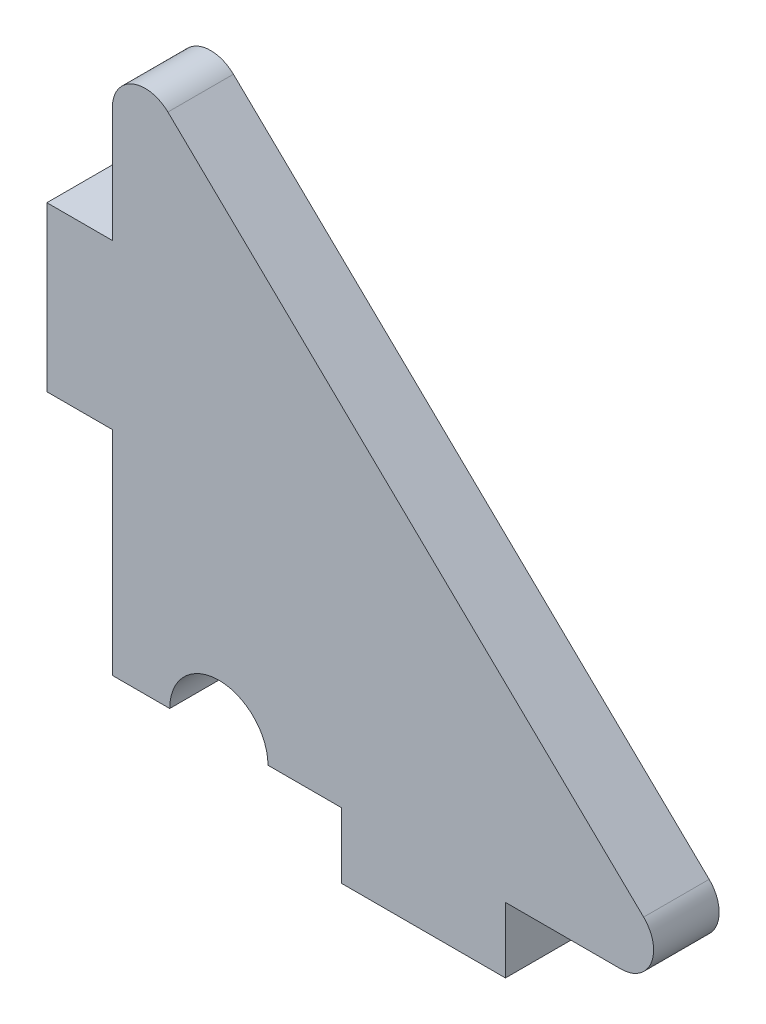
ISO-10303-21;
HEADER;
FILE_DESCRIPTION(('STEP AP214'),'2;1');
FILE_NAME('part.step','',(''),(''),'','','');
FILE_SCHEMA(('AUTOMOTIVE_DESIGN { 1 0 10303 214 1 1 1 1 }'));
ENDSEC;
DATA;
#1=APPLICATION_CONTEXT('core data for automotive mechanical design processes');
#2=APPLICATION_PROTOCOL_DEFINITION('international standard','automotive_design',2000,#1);
#3=PRODUCT_CONTEXT('',#1,'mechanical');
#4=PRODUCT('Part','Part','',(#3));
#5=PRODUCT_RELATED_PRODUCT_CATEGORY('part','',(#4));
#6=PRODUCT_DEFINITION_FORMATION('','',#4);
#7=PRODUCT_DEFINITION_CONTEXT('part definition',#1,'design');
#8=PRODUCT_DEFINITION('design','',#6,#7);
#9=PRODUCT_DEFINITION_SHAPE('','',#8);
#10=(LENGTH_UNIT() NAMED_UNIT(*) SI_UNIT(.MILLI.,.METRE.));
#11=(NAMED_UNIT(*) PLANE_ANGLE_UNIT() SI_UNIT($,.RADIAN.));
#12=(NAMED_UNIT(*) SI_UNIT($,.STERADIAN.) SOLID_ANGLE_UNIT());
#13=UNCERTAINTY_MEASURE_WITH_UNIT(LENGTH_MEASURE(1.E-05),#10,'distance_accuracy_value','');
#14=(GEOMETRIC_REPRESENTATION_CONTEXT(3) GLOBAL_UNCERTAINTY_ASSIGNED_CONTEXT((#13)) GLOBAL_UNIT_ASSIGNED_CONTEXT((#10,
#11,#12)) REPRESENTATION_CONTEXT('',''));
#15=CARTESIAN_POINT('',(0.,0.,0.));
#16=DIRECTION('',(0.,0.,1.));
#17=DIRECTION('',(1.,0.,0.));
#18=AXIS2_PLACEMENT_3D('',#15,#16,#17);
#19=CARTESIAN_POINT('',(0.,0.,4.));
#20=DIRECTION('',(1.,0.,0.));
#21=DIRECTION('',(0.,0.,-1.));
#22=AXIS2_PLACEMENT_3D('',#19,#20,#21);
#23=PLANE('',#22);
#24=DIRECTION('',(0.,-1.,0.));
#25=VECTOR('',#24,1.);
#26=CARTESIAN_POINT('',(0.,0.,0.));
#27=LINE('',#26,#25);
#28=CARTESIAN_POINT('',(0.,13.,0.));
#29=VERTEX_POINT('',#28);
#30=CARTESIAN_POINT('',(0.,0.,0.));
#31=VERTEX_POINT('',#30);
#32=EDGE_CURVE('E171',#29,#31,#27,.T.);
#33=ORIENTED_EDGE('',*,*,#32,.T.);
#34=DIRECTION('',(0.,0.,-1.));
#35=VECTOR('',#34,1.);
#36=CARTESIAN_POINT('',(0.,0.,4.));
#37=LINE('',#36,#35);
#38=CARTESIAN_POINT('',(0.,0.,4.));
#39=VERTEX_POINT('',#38);
#40=EDGE_CURVE('E11',#39,#31,#37,.T.);
#41=ORIENTED_EDGE('',*,*,#40,.F.);
#42=DIRECTION('',(0.,-1.,0.));
#43=VECTOR('',#42,1.);
#44=CARTESIAN_POINT('',(0.,0.,4.));
#45=LINE('',#44,#43);
#46=CARTESIAN_POINT('',(0.,13.,4.));
#47=VERTEX_POINT('',#46);
#48=EDGE_CURVE('E199',#47,#39,#45,.T.);
#49=ORIENTED_EDGE('',*,*,#48,.F.);
#50=DIRECTION('',(0.,0.,-1.));
#51=VECTOR('',#50,1.);
#52=CARTESIAN_POINT('',(0.,13.,4.));
#53=LINE('',#52,#51);
#54=EDGE_CURVE('E167',#47,#29,#53,.T.);
#55=ORIENTED_EDGE('',*,*,#54,.T.);
#56=EDGE_LOOP('',(#33,#41,#49,#55));
#57=FACE_BOUND('',#56,.T.);
#58=ADVANCED_FACE('F33',(#57),#23,.F.);
#59=CARTESIAN_POINT('',(0.,0.,4.));
#60=DIRECTION('',(0.,1.,0.));
#61=DIRECTION('',(0.,0.,1.));
#62=AXIS2_PLACEMENT_3D('',#59,#60,#61);
#63=PLANE('',#62);
#64=DIRECTION('',(1.,0.,0.));
#65=VECTOR('',#64,1.);
#66=CARTESIAN_POINT('',(0.,0.,0.));
#67=LINE('',#66,#65);
#68=CARTESIAN_POINT('',(3.5,0.,0.));
#69=VERTEX_POINT('',#68);
#70=EDGE_CURVE('E174',#31,#69,#67,.T.);
#71=ORIENTED_EDGE('',*,*,#70,.T.);
#72=DIRECTION('',(0.,0.,-1.));
#73=VECTOR('',#72,1.);
#74=CARTESIAN_POINT('',(3.5,0.,4.));
#75=LINE('',#74,#73);
#76=CARTESIAN_POINT('',(3.5,0.,4.));
#77=VERTEX_POINT('',#76);
#78=EDGE_CURVE('E41',#77,#69,#75,.T.);
#79=ORIENTED_EDGE('',*,*,#78,.F.);
#80=DIRECTION('',(1.,0.,0.));
#81=VECTOR('',#80,1.);
#82=CARTESIAN_POINT('',(0.,0.,4.));
#83=LINE('',#82,#81);
#84=EDGE_CURVE('E113',#39,#77,#83,.T.);
#85=ORIENTED_EDGE('',*,*,#84,.F.);
#86=ORIENTED_EDGE('',*,*,#40,.T.);
#87=EDGE_LOOP('',(#71,#79,#85,#86));
#88=FACE_BOUND('',#87,.T.);
#89=ADVANCED_FACE('F292',(#88),#63,.F.);
#90=CARTESIAN_POINT('',(6.5,0.,4.));
#91=DIRECTION('',(0.,0.,-1.));
#92=DIRECTION('',(-1.,0.,0.));
#93=AXIS2_PLACEMENT_3D('',#90,#91,#92);
#94=CYLINDRICAL_SURFACE('',#93,3.);
#95=CARTESIAN_POINT('',(6.5,0.,0.));
#96=DIRECTION('',(0.,0.,-1.));
#97=DIRECTION('',(1.,0.,0.));
#98=AXIS2_PLACEMENT_3D('',#95,#96,#97);
#99=CIRCLE('',#98,3.);
#100=CARTESIAN_POINT('',(9.5,0.,0.));
#101=VERTEX_POINT('',#100);
#102=EDGE_CURVE('E176',#69,#101,#99,.T.);
#103=ORIENTED_EDGE('',*,*,#102,.T.);
#104=DIRECTION('',(0.,0.,-1.));
#105=VECTOR('',#104,1.);
#106=CARTESIAN_POINT('',(9.5,0.,4.));
#107=LINE('',#106,#105);
#108=CARTESIAN_POINT('',(9.5,0.,4.));
#109=VERTEX_POINT('',#108);
#110=EDGE_CURVE('E227',#109,#101,#107,.T.);
#111=ORIENTED_EDGE('',*,*,#110,.F.);
#112=CARTESIAN_POINT('',(6.5,0.,4.));
#113=DIRECTION('',(0.,0.,-1.));
#114=DIRECTION('',(1.,0.,0.));
#115=AXIS2_PLACEMENT_3D('',#112,#113,#114);
#116=CIRCLE('',#115,3.);
#117=EDGE_CURVE('E235',#77,#109,#116,.T.);
#118=ORIENTED_EDGE('',*,*,#117,.F.);
#119=ORIENTED_EDGE('',*,*,#78,.T.);
#120=EDGE_LOOP('',(#103,#111,#118,#119));
#121=FACE_BOUND('',#120,.T.);
#122=ADVANCED_FACE('F233',(#121),#94,.F.);
#123=CARTESIAN_POINT('',(14.,0.,4.));
#124=DIRECTION('',(0.,1.,0.));
#125=DIRECTION('',(0.,0.,1.));
#126=AXIS2_PLACEMENT_3D('',#123,#124,#125);
#127=PLANE('',#126);
#128=DIRECTION('',(1.,0.,0.));
#129=VECTOR('',#128,1.);
#130=CARTESIAN_POINT('',(14.,0.,0.));
#131=LINE('',#130,#129);
#132=CARTESIAN_POINT('',(14.,0.,0.));
#133=VERTEX_POINT('',#132);
#134=EDGE_CURVE('E178',#101,#133,#131,.T.);
#135=ORIENTED_EDGE('',*,*,#134,.T.);
#136=DIRECTION('',(0.,0.,-1.));
#137=VECTOR('',#136,1.);
#138=CARTESIAN_POINT('',(14.,0.,4.));
#139=LINE('',#138,#137);
#140=CARTESIAN_POINT('',(14.,0.,4.));
#141=VERTEX_POINT('',#140);
#142=EDGE_CURVE('E224',#141,#133,#139,.T.);
#143=ORIENTED_EDGE('',*,*,#142,.F.);
#144=DIRECTION('',(1.,0.,0.));
#145=VECTOR('',#144,1.);
#146=CARTESIAN_POINT('',(14.,0.,4.));
#147=LINE('',#146,#145);
#148=EDGE_CURVE('E253',#109,#141,#147,.T.);
#149=ORIENTED_EDGE('',*,*,#148,.F.);
#150=ORIENTED_EDGE('',*,*,#110,.T.);
#151=EDGE_LOOP('',(#135,#143,#149,#150));
#152=FACE_BOUND('',#151,.T.);
#153=ADVANCED_FACE('F244',(#152),#127,.F.);
#154=CARTESIAN_POINT('',(14.,0.,4.));
#155=DIRECTION('',(1.,0.,0.));
#156=DIRECTION('',(0.,0.,-1.));
#157=AXIS2_PLACEMENT_3D('',#154,#155,#156);
#158=PLANE('',#157);
#159=DIRECTION('',(0.,-1.,0.));
#160=VECTOR('',#159,1.);
#161=CARTESIAN_POINT('',(14.,0.,0.));
#162=LINE('',#161,#160);
#163=CARTESIAN_POINT('',(14.,-4.,0.));
#164=VERTEX_POINT('',#163);
#165=EDGE_CURVE('E180',#133,#164,#162,.T.);
#166=ORIENTED_EDGE('',*,*,#165,.T.);
#167=DIRECTION('',(0.,0.,-1.));
#168=VECTOR('',#167,1.);
#169=CARTESIAN_POINT('',(14.,-4.,4.));
#170=LINE('',#169,#168);
#171=CARTESIAN_POINT('',(14.,-4.,4.));
#172=VERTEX_POINT('',#171);
#173=EDGE_CURVE('E221',#172,#164,#170,.T.);
#174=ORIENTED_EDGE('',*,*,#173,.F.);
#175=DIRECTION('',(0.,-1.,0.));
#176=VECTOR('',#175,1.);
#177=CARTESIAN_POINT('',(14.,0.,4.));
#178=LINE('',#177,#176);
#179=EDGE_CURVE('E250',#141,#172,#178,.T.);
#180=ORIENTED_EDGE('',*,*,#179,.F.);
#181=ORIENTED_EDGE('',*,*,#142,.T.);
#182=EDGE_LOOP('',(#166,#174,#180,#181));
#183=FACE_BOUND('',#182,.T.);
#184=ADVANCED_FACE('F248',(#183),#158,.F.);
#185=CARTESIAN_POINT('',(14.,-4.,4.));
#186=DIRECTION('',(0.,1.,0.));
#187=DIRECTION('',(0.,0.,1.));
#188=AXIS2_PLACEMENT_3D('',#185,#186,#187);
#189=PLANE('',#188);
#190=DIRECTION('',(1.,0.,0.));
#191=VECTOR('',#190,1.);
#192=CARTESIAN_POINT('',(14.,-4.,0.));
#193=LINE('',#192,#191);
#194=CARTESIAN_POINT('',(24.,-4.,0.));
#195=VERTEX_POINT('',#194);
#196=EDGE_CURVE('E182',#164,#195,#193,.T.);
#197=ORIENTED_EDGE('',*,*,#196,.T.);
#198=DIRECTION('',(0.,0.,-1.));
#199=VECTOR('',#198,1.);
#200=CARTESIAN_POINT('',(24.,-4.,4.));
#201=LINE('',#200,#199);
#202=CARTESIAN_POINT('',(24.,-4.,4.));
#203=VERTEX_POINT('',#202);
#204=EDGE_CURVE('E218',#203,#195,#201,.T.);
#205=ORIENTED_EDGE('',*,*,#204,.F.);
#206=DIRECTION('',(1.,0.,0.));
#207=VECTOR('',#206,1.);
#208=CARTESIAN_POINT('',(14.,-4.,4.));
#209=LINE('',#208,#207);
#210=EDGE_CURVE('E252',#172,#203,#209,.T.);
#211=ORIENTED_EDGE('',*,*,#210,.F.);
#212=ORIENTED_EDGE('',*,*,#173,.T.);
#213=EDGE_LOOP('',(#197,#205,#211,#212));
#214=FACE_BOUND('',#213,.T.);
#215=ADVANCED_FACE('F305',(#214),#189,.F.);
#216=CARTESIAN_POINT('',(24.,-4.,4.));
#217=DIRECTION('',(-1.,0.,0.));
#218=DIRECTION('',(0.,0.,1.));
#219=AXIS2_PLACEMENT_3D('',#216,#217,#218);
#220=PLANE('',#219);
#221=DIRECTION('',(0.,1.,0.));
#222=VECTOR('',#221,1.);
#223=CARTESIAN_POINT('',(24.,-4.,0.));
#224=LINE('',#223,#222);
#225=CARTESIAN_POINT('',(24.,0.,0.));
#226=VERTEX_POINT('',#225);
#227=EDGE_CURVE('E184',#195,#226,#224,.T.);
#228=ORIENTED_EDGE('',*,*,#227,.T.);
#229=DIRECTION('',(0.,0.,-1.));
#230=VECTOR('',#229,1.);
#231=CARTESIAN_POINT('',(24.,0.,4.));
#232=LINE('',#231,#230);
#233=CARTESIAN_POINT('',(24.,0.,4.));
#234=VERTEX_POINT('',#233);
#235=EDGE_CURVE('E215',#234,#226,#232,.T.);
#236=ORIENTED_EDGE('',*,*,#235,.F.);
#237=DIRECTION('',(0.,1.,0.));
#238=VECTOR('',#237,1.);
#239=CARTESIAN_POINT('',(24.,-4.,4.));
#240=LINE('',#239,#238);
#241=EDGE_CURVE('E255',#203,#234,#240,.T.);
#242=ORIENTED_EDGE('',*,*,#241,.F.);
#243=ORIENTED_EDGE('',*,*,#204,.T.);
#244=EDGE_LOOP('',(#228,#236,#242,#243));
#245=FACE_BOUND('',#244,.T.);
#246=ADVANCED_FACE('F308',(#245),#220,.F.);
#247=CARTESIAN_POINT('',(24.,0.,4.));
#248=DIRECTION('',(0.,1.,0.));
#249=DIRECTION('',(0.,0.,1.));
#250=AXIS2_PLACEMENT_3D('',#247,#248,#249);
#251=PLANE('',#250);
#252=DIRECTION('',(1.,0.,0.));
#253=VECTOR('',#252,1.);
#254=CARTESIAN_POINT('',(24.,0.,0.));
#255=LINE('',#254,#253);
#256=CARTESIAN_POINT('',(31.0494100017735,0.,0.));
#257=VERTEX_POINT('',#256);
#258=EDGE_CURVE('E186',#226,#257,#255,.T.);
#259=ORIENTED_EDGE('',*,*,#258,.T.);
#260=DIRECTION('',(0.,0.,-1.));
#261=VECTOR('',#260,1.);
#262=CARTESIAN_POINT('',(31.0494100017735,0.,4.));
#263=LINE('',#262,#261);
#264=CARTESIAN_POINT('',(31.0494100017735,0.,4.));
#265=VERTEX_POINT('',#264);
#266=EDGE_CURVE('E212',#265,#257,#263,.T.);
#267=ORIENTED_EDGE('',*,*,#266,.F.);
#268=DIRECTION('',(1.,0.,0.));
#269=VECTOR('',#268,1.);
#270=CARTESIAN_POINT('',(24.,0.,4.));
#271=LINE('',#270,#269);
#272=EDGE_CURVE('E261',#234,#265,#271,.T.);
#273=ORIENTED_EDGE('',*,*,#272,.F.);
#274=ORIENTED_EDGE('',*,*,#235,.T.);
#275=EDGE_LOOP('',(#259,#267,#273,#274));
#276=FACE_BOUND('',#275,.T.);
#277=ADVANCED_FACE('F312',(#276),#251,.F.);
#278=CARTESIAN_POINT('',(31.0494100017735,2.,4.));
#279=DIRECTION('',(0.,0.,-1.));
#280=DIRECTION('',(-1.,0.,0.));
#281=AXIS2_PLACEMENT_3D('',#278,#279,#280);
#282=CYLINDRICAL_SURFACE('',#281,2.);
#283=CARTESIAN_POINT('',(31.0494100017735,2.,0.));
#284=DIRECTION('',(0.,0.,1.));
#285=DIRECTION('',(-1.,0.,0.));
#286=AXIS2_PLACEMENT_3D('',#283,#284,#285);
#287=CIRCLE('',#286,2.);
#288=CARTESIAN_POINT('',(32.4386427013057,3.43876075375667,0.));
#289=VERTEX_POINT('',#288);
#290=EDGE_CURVE('E188',#257,#289,#287,.T.);
#291=ORIENTED_EDGE('',*,*,#290,.T.);
#292=DIRECTION('',(0.,0.,-1.));
#293=VECTOR('',#292,1.);
#294=CARTESIAN_POINT('',(32.4386427013057,3.43876075375667,4.));
#295=LINE('',#294,#293);
#296=CARTESIAN_POINT('',(32.4386427013057,3.43876075375667,4.));
#297=VERTEX_POINT('',#296);
#298=EDGE_CURVE('E209',#297,#289,#295,.T.);
#299=ORIENTED_EDGE('',*,*,#298,.F.);
#300=CARTESIAN_POINT('',(31.0494100017735,2.,4.));
#301=DIRECTION('',(0.,0.,1.));
#302=DIRECTION('',(-1.,0.,0.));
#303=AXIS2_PLACEMENT_3D('',#300,#301,#302);
#304=CIRCLE('',#303,2.);
#305=EDGE_CURVE('E263',#265,#297,#304,.T.);
#306=ORIENTED_EDGE('',*,*,#305,.F.);
#307=ORIENTED_EDGE('',*,*,#266,.T.);
#308=EDGE_LOOP('',(#291,#299,#306,#307));
#309=FACE_BOUND('',#308,.T.);
#310=ADVANCED_FACE('F316',(#309),#282,.T.);
#311=CARTESIAN_POINT('',(3.3892326995322,31.4881707555302,4.));
#312=DIRECTION('',(-0.694616349766102,-0.719380376878336,0.));
#313=DIRECTION('',(0.719380376878336,-0.694616349766102,0.));
#314=AXIS2_PLACEMENT_3D('',#311,#312,#313);
#315=PLANE('',#314);
#316=DIRECTION('',(-0.719380376878336,0.694616349766102,0.));
#317=VECTOR('',#316,1.);
#318=CARTESIAN_POINT('',(3.3892326995322,31.4881707555302,0.));
#319=LINE('',#318,#317);
#320=CARTESIAN_POINT('',(3.3892326995322,31.4881707555302,0.));
#321=VERTEX_POINT('',#320);
#322=EDGE_CURVE('E190',#289,#321,#319,.T.);
#323=ORIENTED_EDGE('',*,*,#322,.T.);
#324=DIRECTION('',(0.,0.,-1.));
#325=VECTOR('',#324,1.);
#326=CARTESIAN_POINT('',(3.3892326995322,31.4881707555302,4.));
#327=LINE('',#326,#325);
#328=CARTESIAN_POINT('',(3.3892326995322,31.4881707555302,4.));
#329=VERTEX_POINT('',#328);
#330=EDGE_CURVE('E206',#329,#321,#327,.T.);
#331=ORIENTED_EDGE('',*,*,#330,.F.);
#332=DIRECTION('',(-0.719380376878336,0.694616349766102,0.));
#333=VECTOR('',#332,1.);
#334=CARTESIAN_POINT('',(3.3892326995322,31.4881707555302,4.));
#335=LINE('',#334,#333);
#336=EDGE_CURVE('E265',#297,#329,#335,.T.);
#337=ORIENTED_EDGE('',*,*,#336,.F.);
#338=ORIENTED_EDGE('',*,*,#298,.T.);
#339=EDGE_LOOP('',(#323,#331,#337,#338));
#340=FACE_BOUND('',#339,.T.);
#341=ADVANCED_FACE('F320',(#340),#315,.F.);
#342=CARTESIAN_POINT('',(2.,30.0494100017735,4.));
#343=DIRECTION('',(0.,0.,-1.));
#344=DIRECTION('',(-1.,0.,0.));
#345=AXIS2_PLACEMENT_3D('',#342,#343,#344);
#346=CYLINDRICAL_SURFACE('',#345,2.);
#347=CARTESIAN_POINT('',(2.,30.0494100017735,0.));
#348=DIRECTION('',(0.,0.,1.));
#349=DIRECTION('',(1.,0.,0.));
#350=AXIS2_PLACEMENT_3D('',#347,#348,#349);
#351=CIRCLE('',#350,2.);
#352=CARTESIAN_POINT('',(0.,30.0494100017735,0.));
#353=VERTEX_POINT('',#352);
#354=EDGE_CURVE('E192',#321,#353,#351,.T.);
#355=ORIENTED_EDGE('',*,*,#354,.T.);
#356=DIRECTION('',(0.,0.,-1.));
#357=VECTOR('',#356,1.);
#358=CARTESIAN_POINT('',(0.,30.0494100017735,4.));
#359=LINE('',#358,#357);
#360=CARTESIAN_POINT('',(0.,30.0494100017735,4.));
#361=VERTEX_POINT('',#360);
#362=EDGE_CURVE('E203',#361,#353,#359,.T.);
#363=ORIENTED_EDGE('',*,*,#362,.F.);
#364=CARTESIAN_POINT('',(2.,30.0494100017735,4.));
#365=DIRECTION('',(0.,0.,1.));
#366=DIRECTION('',(1.,0.,0.));
#367=AXIS2_PLACEMENT_3D('',#364,#365,#366);
#368=CIRCLE('',#367,2.);
#369=EDGE_CURVE('E267',#329,#361,#368,.T.);
#370=ORIENTED_EDGE('',*,*,#369,.F.);
#371=ORIENTED_EDGE('',*,*,#330,.T.);
#372=EDGE_LOOP('',(#355,#363,#370,#371));
#373=FACE_BOUND('',#372,.T.);
#374=ADVANCED_FACE('F273',(#373),#346,.T.);
#375=CARTESIAN_POINT('',(0.,23.,4.));
#376=DIRECTION('',(1.,0.,0.));
#377=DIRECTION('',(0.,1.,0.));
#378=AXIS2_PLACEMENT_3D('',#375,#376,#377);
#379=PLANE('',#378);
#380=DIRECTION('',(0.,-1.,0.));
#381=VECTOR('',#380,1.);
#382=CARTESIAN_POINT('',(0.,23.,0.));
#383=LINE('',#382,#381);
#384=CARTESIAN_POINT('',(0.,23.,0.));
#385=VERTEX_POINT('',#384);
#386=EDGE_CURVE('E194',#353,#385,#383,.T.);
#387=ORIENTED_EDGE('',*,*,#386,.T.);
#388=DIRECTION('',(0.,0.,-1.));
#389=VECTOR('',#388,1.);
#390=CARTESIAN_POINT('',(0.,23.,4.));
#391=LINE('',#390,#389);
#392=CARTESIAN_POINT('',(0.,23.,4.));
#393=VERTEX_POINT('',#392);
#394=EDGE_CURVE('E162',#393,#385,#391,.T.);
#395=ORIENTED_EDGE('',*,*,#394,.F.);
#396=DIRECTION('',(0.,-1.,0.));
#397=VECTOR('',#396,1.);
#398=CARTESIAN_POINT('',(0.,23.,4.));
#399=LINE('',#398,#397);
#400=EDGE_CURVE('E153',#361,#393,#399,.T.);
#401=ORIENTED_EDGE('',*,*,#400,.F.);
#402=ORIENTED_EDGE('',*,*,#362,.T.);
#403=EDGE_LOOP('',(#387,#395,#401,#402));
#404=FACE_BOUND('',#403,.T.);
#405=ADVANCED_FACE('F277',(#404),#379,.F.);
#406=CARTESIAN_POINT('',(-4.,23.,4.));
#407=DIRECTION('',(0.,-1.,0.));
#408=DIRECTION('',(0.,0.,-1.));
#409=AXIS2_PLACEMENT_3D('',#406,#407,#408);
#410=PLANE('',#409);
#411=DIRECTION('',(-1.,0.,0.));
#412=VECTOR('',#411,1.);
#413=CARTESIAN_POINT('',(-4.,23.,0.));
#414=LINE('',#413,#412);
#415=CARTESIAN_POINT('',(-4.,23.,0.));
#416=VERTEX_POINT('',#415);
#417=EDGE_CURVE('E161',#385,#416,#414,.T.);
#418=ORIENTED_EDGE('',*,*,#417,.T.);
#419=DIRECTION('',(0.,0.,-1.));
#420=VECTOR('',#419,1.);
#421=CARTESIAN_POINT('',(-4.,23.,4.));
#422=LINE('',#421,#420);
#423=CARTESIAN_POINT('',(-4.,23.,4.));
#424=VERTEX_POINT('',#423);
#425=EDGE_CURVE('E158',#424,#416,#422,.T.);
#426=ORIENTED_EDGE('',*,*,#425,.F.);
#427=DIRECTION('',(-1.,0.,0.));
#428=VECTOR('',#427,1.);
#429=CARTESIAN_POINT('',(-4.,23.,4.));
#430=LINE('',#429,#428);
#431=EDGE_CURVE('E147',#393,#424,#430,.T.);
#432=ORIENTED_EDGE('',*,*,#431,.F.);
#433=ORIENTED_EDGE('',*,*,#394,.T.);
#434=EDGE_LOOP('',(#418,#426,#432,#433));
#435=FACE_BOUND('',#434,.T.);
#436=ADVANCED_FACE('F159',(#435),#410,.F.);
#437=CARTESIAN_POINT('',(-4.,13.,4.));
#438=DIRECTION('',(1.,0.,0.));
#439=DIRECTION('',(0.,0.,-1.));
#440=AXIS2_PLACEMENT_3D('',#437,#438,#439);
#441=PLANE('',#440);
#442=DIRECTION('',(0.,-1.,0.));
#443=VECTOR('',#442,1.);
#444=CARTESIAN_POINT('',(-4.,13.,0.));
#445=LINE('',#444,#443);
#446=CARTESIAN_POINT('',(-4.,13.,0.));
#447=VERTEX_POINT('',#446);
#448=EDGE_CURVE('E99',#416,#447,#445,.T.);
#449=ORIENTED_EDGE('',*,*,#448,.T.);
#450=DIRECTION('',(0.,0.,-1.));
#451=VECTOR('',#450,1.);
#452=CARTESIAN_POINT('',(-4.,13.,4.));
#453=LINE('',#452,#451);
#454=CARTESIAN_POINT('',(-4.,13.,4.));
#455=VERTEX_POINT('',#454);
#456=EDGE_CURVE('E163',#455,#447,#453,.T.);
#457=ORIENTED_EDGE('',*,*,#456,.F.);
#458=DIRECTION('',(0.,-1.,0.));
#459=VECTOR('',#458,1.);
#460=CARTESIAN_POINT('',(-4.,13.,4.));
#461=LINE('',#460,#459);
#462=EDGE_CURVE('E151',#424,#455,#461,.T.);
#463=ORIENTED_EDGE('',*,*,#462,.F.);
#464=ORIENTED_EDGE('',*,*,#425,.T.);
#465=EDGE_LOOP('',(#449,#457,#463,#464));
#466=FACE_BOUND('',#465,.T.);
#467=ADVANCED_FACE('F165',(#466),#441,.F.);
#468=CARTESIAN_POINT('',(0.,13.,4.));
#469=DIRECTION('',(0.,1.,0.));
#470=DIRECTION('',(0.,0.,1.));
#471=AXIS2_PLACEMENT_3D('',#468,#469,#470);
#472=PLANE('',#471);
#473=DIRECTION('',(1.,0.,0.));
#474=VECTOR('',#473,1.);
#475=CARTESIAN_POINT('',(0.,13.,0.));
#476=LINE('',#475,#474);
#477=EDGE_CURVE('E105',#447,#29,#476,.T.);
#478=ORIENTED_EDGE('',*,*,#477,.T.);
#479=ORIENTED_EDGE('',*,*,#54,.F.);
#480=DIRECTION('',(1.,0.,0.));
#481=VECTOR('',#480,1.);
#482=CARTESIAN_POINT('',(0.,13.,4.));
#483=LINE('',#482,#481);
#484=EDGE_CURVE('E49',#455,#47,#483,.T.);
#485=ORIENTED_EDGE('',*,*,#484,.F.);
#486=ORIENTED_EDGE('',*,*,#456,.T.);
#487=EDGE_LOOP('',(#478,#479,#485,#486));
#488=FACE_BOUND('',#487,.T.);
#489=ADVANCED_FACE('F281',(#488),#472,.F.);
#490=CARTESIAN_POINT('',(2.,30.0494100017735,4.));
#491=DIRECTION('',(0.,0.,1.));
#492=DIRECTION('',(1.,0.,0.));
#493=AXIS2_PLACEMENT_3D('',#490,#491,#492);
#494=PLANE('',#493);
#495=ORIENTED_EDGE('',*,*,#48,.T.);
#496=ORIENTED_EDGE('',*,*,#84,.T.);
#497=ORIENTED_EDGE('',*,*,#117,.T.);
#498=ORIENTED_EDGE('',*,*,#148,.T.);
#499=ORIENTED_EDGE('',*,*,#179,.T.);
#500=ORIENTED_EDGE('',*,*,#210,.T.);
#501=ORIENTED_EDGE('',*,*,#241,.T.);
#502=ORIENTED_EDGE('',*,*,#272,.T.);
#503=ORIENTED_EDGE('',*,*,#305,.T.);
#504=ORIENTED_EDGE('',*,*,#336,.T.);
#505=ORIENTED_EDGE('',*,*,#369,.T.);
#506=ORIENTED_EDGE('',*,*,#400,.T.);
#507=ORIENTED_EDGE('',*,*,#431,.T.);
#508=ORIENTED_EDGE('',*,*,#462,.T.);
#509=ORIENTED_EDGE('',*,*,#484,.T.);
#510=EDGE_LOOP('',(#495,#496,#497,#498,#499,#500,#501,#502,#503,#504,#505,#506,#507,#508,#509));
#511=FACE_BOUND('',#510,.T.);
#512=ADVANCED_FACE('F149',(#511),#494,.T.);
#513=CARTESIAN_POINT('',(2.,30.0494100017735,0.));
#514=DIRECTION('',(0.,0.,1.));
#515=DIRECTION('',(1.,0.,0.));
#516=AXIS2_PLACEMENT_3D('',#513,#514,#515);
#517=PLANE('',#516);
#518=ORIENTED_EDGE('',*,*,#32,.F.);
#519=ORIENTED_EDGE('',*,*,#477,.F.);
#520=ORIENTED_EDGE('',*,*,#448,.F.);
#521=ORIENTED_EDGE('',*,*,#417,.F.);
#522=ORIENTED_EDGE('',*,*,#386,.F.);
#523=ORIENTED_EDGE('',*,*,#354,.F.);
#524=ORIENTED_EDGE('',*,*,#322,.F.);
#525=ORIENTED_EDGE('',*,*,#290,.F.);
#526=ORIENTED_EDGE('',*,*,#258,.F.);
#527=ORIENTED_EDGE('',*,*,#227,.F.);
#528=ORIENTED_EDGE('',*,*,#196,.F.);
#529=ORIENTED_EDGE('',*,*,#165,.F.);
#530=ORIENTED_EDGE('',*,*,#134,.F.);
#531=ORIENTED_EDGE('',*,*,#102,.F.);
#532=ORIENTED_EDGE('',*,*,#70,.F.);
#533=EDGE_LOOP('',(#518,#519,#520,#521,#522,#523,#524,#525,#526,#527,#528,#529,#530,#531,#532));
#534=FACE_BOUND('',#533,.T.);
#535=ADVANCED_FACE('F239',(#534),#517,.F.);
#536=CLOSED_SHELL('',(#58,#89,#122,#153,#184,#215,#246,#277,#310,#341,#374,#405,#436,#467,#489,
#512,#535));
#537=MANIFOLD_SOLID_BREP('B2',#536);
#538=ADVANCED_BREP_SHAPE_REPRESENTATION('',(#18,#537),#14);
#539=SHAPE_DEFINITION_REPRESENTATION(#9,#538);
ENDSEC;
END-ISO-10303-21;
